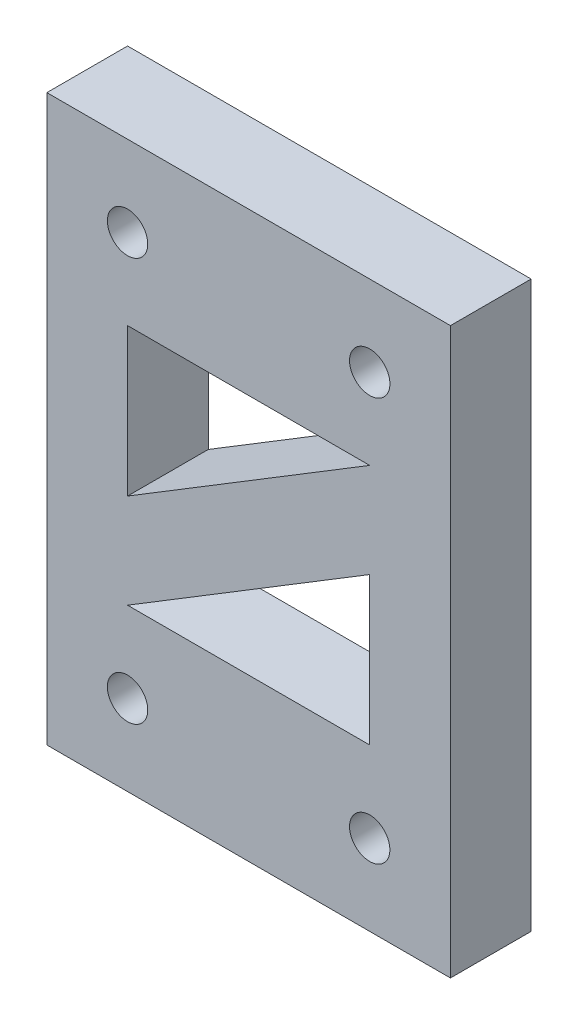
ISO-10303-21;
HEADER;
FILE_DESCRIPTION(('STEP AP214'),'2;1');
FILE_NAME('part.step','',(''),(''),'','','');
FILE_SCHEMA(('AUTOMOTIVE_DESIGN { 1 0 10303 214 1 1 1 1 }'));
ENDSEC;
DATA;
#1=APPLICATION_CONTEXT('core data for automotive mechanical design processes');
#2=APPLICATION_PROTOCOL_DEFINITION('international standard','automotive_design',2000,#1);
#3=PRODUCT_CONTEXT('',#1,'mechanical');
#4=PRODUCT('Part','Part','',(#3));
#5=PRODUCT_RELATED_PRODUCT_CATEGORY('part','',(#4));
#6=PRODUCT_DEFINITION_FORMATION('','',#4);
#7=PRODUCT_DEFINITION_CONTEXT('part definition',#1,'design');
#8=PRODUCT_DEFINITION('design','',#6,#7);
#9=PRODUCT_DEFINITION_SHAPE('','',#8);
#10=(LENGTH_UNIT() NAMED_UNIT(*) SI_UNIT(.MILLI.,.METRE.));
#11=(NAMED_UNIT(*) PLANE_ANGLE_UNIT() SI_UNIT($,.RADIAN.));
#12=(NAMED_UNIT(*) SI_UNIT($,.STERADIAN.) SOLID_ANGLE_UNIT());
#13=UNCERTAINTY_MEASURE_WITH_UNIT(LENGTH_MEASURE(1.E-05),#10,'distance_accuracy_value','');
#14=(GEOMETRIC_REPRESENTATION_CONTEXT(3) GLOBAL_UNCERTAINTY_ASSIGNED_CONTEXT((#13)) GLOBAL_UNIT_ASSIGNED_CONTEXT((#10,
#11,#12)) REPRESENTATION_CONTEXT('',''));
#15=CARTESIAN_POINT('',(0.,0.,0.));
#16=DIRECTION('',(0.,0.,1.));
#17=DIRECTION('',(1.,0.,0.));
#18=AXIS2_PLACEMENT_3D('',#15,#16,#17);
#19=CARTESIAN_POINT('',(0.,0.,-10.));
#20=DIRECTION('',(-1.,0.,0.));
#21=DIRECTION('',(0.,0.,1.));
#22=AXIS2_PLACEMENT_3D('',#19,#20,#21);
#23=PLANE('',#22);
#24=DIRECTION('',(0.,-1.,0.));
#25=VECTOR('',#24,1.);
#26=CARTESIAN_POINT('',(0.,0.,0.));
#27=LINE('',#26,#25);
#28=CARTESIAN_POINT('',(0.,70.,0.));
#29=VERTEX_POINT('',#28);
#30=CARTESIAN_POINT('',(0.,0.,0.));
#31=VERTEX_POINT('',#30);
#32=EDGE_CURVE('E178',#29,#31,#27,.T.);
#33=ORIENTED_EDGE('',*,*,#32,.F.);
#34=DIRECTION('',(0.,0.,1.));
#35=VECTOR('',#34,1.);
#36=CARTESIAN_POINT('',(0.,70.,-10.));
#37=LINE('',#36,#35);
#38=CARTESIAN_POINT('',(0.,70.,-10.));
#39=VERTEX_POINT('',#38);
#40=EDGE_CURVE('E11',#39,#29,#37,.T.);
#41=ORIENTED_EDGE('',*,*,#40,.F.);
#42=DIRECTION('',(0.,-1.,0.));
#43=VECTOR('',#42,1.);
#44=CARTESIAN_POINT('',(0.,0.,-10.));
#45=LINE('',#44,#43);
#46=CARTESIAN_POINT('',(0.,0.,-10.));
#47=VERTEX_POINT('',#46);
#48=EDGE_CURVE('E181',#39,#47,#45,.T.);
#49=ORIENTED_EDGE('',*,*,#48,.T.);
#50=DIRECTION('',(0.,0.,1.));
#51=VECTOR('',#50,1.);
#52=CARTESIAN_POINT('',(0.,0.,-10.));
#53=LINE('',#52,#51);
#54=EDGE_CURVE('E42',#47,#31,#53,.T.);
#55=ORIENTED_EDGE('',*,*,#54,.T.);
#56=EDGE_LOOP('',(#33,#41,#49,#55));
#57=FACE_BOUND('',#56,.T.);
#58=ADVANCED_FACE('F39',(#57),#23,.T.);
#59=CARTESIAN_POINT('',(0.,70.,-10.));
#60=DIRECTION('',(0.,1.,0.));
#61=DIRECTION('',(0.,0.,1.));
#62=AXIS2_PLACEMENT_3D('',#59,#60,#61);
#63=PLANE('',#62);
#64=DIRECTION('',(-1.,0.,0.));
#65=VECTOR('',#64,1.);
#66=CARTESIAN_POINT('',(0.,70.,0.));
#67=LINE('',#66,#65);
#68=CARTESIAN_POINT('',(50.,70.,0.));
#69=VERTEX_POINT('',#68);
#70=EDGE_CURVE('E185',#69,#29,#67,.T.);
#71=ORIENTED_EDGE('',*,*,#70,.F.);
#72=DIRECTION('',(0.,0.,1.));
#73=VECTOR('',#72,1.);
#74=CARTESIAN_POINT('',(50.,70.,-10.));
#75=LINE('',#74,#73);
#76=CARTESIAN_POINT('',(50.,70.,-10.));
#77=VERTEX_POINT('',#76);
#78=EDGE_CURVE('E47',#77,#69,#75,.T.);
#79=ORIENTED_EDGE('',*,*,#78,.F.);
#80=DIRECTION('',(-1.,0.,0.));
#81=VECTOR('',#80,1.);
#82=CARTESIAN_POINT('',(0.,70.,-10.));
#83=LINE('',#82,#81);
#84=EDGE_CURVE('E191',#77,#39,#83,.T.);
#85=ORIENTED_EDGE('',*,*,#84,.T.);
#86=ORIENTED_EDGE('',*,*,#40,.T.);
#87=EDGE_LOOP('',(#71,#79,#85,#86));
#88=FACE_BOUND('',#87,.T.);
#89=ADVANCED_FACE('F217',(#88),#63,.T.);
#90=CARTESIAN_POINT('',(50.,0.,-10.));
#91=DIRECTION('',(1.,0.,0.));
#92=DIRECTION('',(0.,0.,-1.));
#93=AXIS2_PLACEMENT_3D('',#90,#91,#92);
#94=PLANE('',#93);
#95=DIRECTION('',(0.,1.,0.));
#96=VECTOR('',#95,1.);
#97=CARTESIAN_POINT('',(50.,0.,0.));
#98=LINE('',#97,#96);
#99=CARTESIAN_POINT('',(50.,0.,0.));
#100=VERTEX_POINT('',#99);
#101=EDGE_CURVE('E199',#100,#69,#98,.T.);
#102=ORIENTED_EDGE('',*,*,#101,.F.);
#103=DIRECTION('',(0.,0.,1.));
#104=VECTOR('',#103,1.);
#105=CARTESIAN_POINT('',(50.,0.,-10.));
#106=LINE('',#105,#104);
#107=CARTESIAN_POINT('',(50.,0.,-10.));
#108=VERTEX_POINT('',#107);
#109=EDGE_CURVE('E204',#108,#100,#106,.T.);
#110=ORIENTED_EDGE('',*,*,#109,.F.);
#111=DIRECTION('',(0.,1.,0.));
#112=VECTOR('',#111,1.);
#113=CARTESIAN_POINT('',(50.,0.,-10.));
#114=LINE('',#113,#112);
#115=EDGE_CURVE('E188',#108,#77,#114,.T.);
#116=ORIENTED_EDGE('',*,*,#115,.T.);
#117=ORIENTED_EDGE('',*,*,#78,.T.);
#118=EDGE_LOOP('',(#102,#110,#116,#117));
#119=FACE_BOUND('',#118,.T.);
#120=ADVANCED_FACE('F222',(#119),#94,.T.);
#121=CARTESIAN_POINT('',(0.,0.,-10.));
#122=DIRECTION('',(0.,-1.,0.));
#123=DIRECTION('',(0.,0.,-1.));
#124=AXIS2_PLACEMENT_3D('',#121,#122,#123);
#125=PLANE('',#124);
#126=DIRECTION('',(1.,0.,0.));
#127=VECTOR('',#126,1.);
#128=CARTESIAN_POINT('',(0.,0.,0.));
#129=LINE('',#128,#127);
#130=EDGE_CURVE('E196',#31,#100,#129,.T.);
#131=ORIENTED_EDGE('',*,*,#130,.F.);
#132=ORIENTED_EDGE('',*,*,#54,.F.);
#133=DIRECTION('',(1.,0.,0.));
#134=VECTOR('',#133,1.);
#135=CARTESIAN_POINT('',(0.,0.,-10.));
#136=LINE('',#135,#134);
#137=EDGE_CURVE('E184',#47,#108,#136,.T.);
#138=ORIENTED_EDGE('',*,*,#137,.T.);
#139=ORIENTED_EDGE('',*,*,#109,.T.);
#140=EDGE_LOOP('',(#131,#132,#138,#139));
#141=FACE_BOUND('',#140,.T.);
#142=ADVANCED_FACE('F212',(#141),#125,.T.);
#143=CARTESIAN_POINT('',(0.,0.,-10.));
#144=DIRECTION('',(0.,0.,-1.));
#145=DIRECTION('',(-1.,0.,0.));
#146=AXIS2_PLACEMENT_3D('',#143,#144,#145);
#147=PLANE('',#146);
#148=CARTESIAN_POINT('',(40.,9.99999999999999,-10.));
#149=DIRECTION('',(0.,0.,-1.));
#150=DIRECTION('',(-1.,0.,0.));
#151=AXIS2_PLACEMENT_3D('',#148,#149,#150);
#152=CIRCLE('',#151,2.5);
#153=CARTESIAN_POINT('',(37.5,9.99999999999999,-10.));
#154=VERTEX_POINT('',#153);
#155=EDGE_CURVE('E402',#154,#154,#152,.F.);
#156=ORIENTED_EDGE('',*,*,#155,.T.);
#157=EDGE_LOOP('',(#156));
#158=FACE_BOUND('',#157,.T.);
#159=CARTESIAN_POINT('',(10.,60.,-10.));
#160=DIRECTION('',(0.,0.,-1.));
#161=DIRECTION('',(-1.,0.,0.));
#162=AXIS2_PLACEMENT_3D('',#159,#160,#161);
#163=CIRCLE('',#162,2.5);
#164=CARTESIAN_POINT('',(7.50000000000001,60.,-10.));
#165=VERTEX_POINT('',#164);
#166=EDGE_CURVE('E406',#165,#165,#163,.F.);
#167=ORIENTED_EDGE('',*,*,#166,.T.);
#168=EDGE_LOOP('',(#167));
#169=FACE_BOUND('',#168,.T.);
#170=DIRECTION('',(0.,-1.,0.));
#171=VECTOR('',#170,1.);
#172=CARTESIAN_POINT('',(10.,31.7116460960662,-10.));
#173=LINE('',#172,#171);
#174=CARTESIAN_POINT('',(10.,50.,-10.));
#175=VERTEX_POINT('',#174);
#176=CARTESIAN_POINT('',(10.,31.7116460960662,-10.));
#177=VERTEX_POINT('',#176);
#178=EDGE_CURVE('E126',#175,#177,#173,.T.);
#179=ORIENTED_EDGE('',*,*,#178,.T.);
#180=DIRECTION('',(0.853850937602943,0.52051760426961,0.));
#181=VECTOR('',#180,1.);
#182=CARTESIAN_POINT('',(40.,50.,-10.));
#183=LINE('',#182,#181);
#184=CARTESIAN_POINT('',(40.,50.,-10.));
#185=VERTEX_POINT('',#184);
#186=EDGE_CURVE('E115',#177,#185,#183,.T.);
#187=ORIENTED_EDGE('',*,*,#186,.T.);
#188=DIRECTION('',(-1.,0.,0.));
#189=VECTOR('',#188,1.);
#190=CARTESIAN_POINT('',(10.,50.,-10.));
#191=LINE('',#190,#189);
#192=EDGE_CURVE('E132',#185,#175,#191,.T.);
#193=ORIENTED_EDGE('',*,*,#192,.T.);
#194=EDGE_LOOP('',(#179,#187,#193));
#195=FACE_BOUND('',#194,.T.);
#196=DIRECTION('',(-0.853850937602944,-0.52051760426961,0.));
#197=VECTOR('',#196,1.);
#198=CARTESIAN_POINT('',(10.,20.,-10.));
#199=LINE('',#198,#197);
#200=CARTESIAN_POINT('',(40.,38.2883539039338,-10.));
#201=VERTEX_POINT('',#200);
#202=CARTESIAN_POINT('',(10.,20.,-10.));
#203=VERTEX_POINT('',#202);
#204=EDGE_CURVE('E147',#201,#203,#199,.T.);
#205=ORIENTED_EDGE('',*,*,#204,.T.);
#206=DIRECTION('',(1.,0.,0.));
#207=VECTOR('',#206,1.);
#208=CARTESIAN_POINT('',(40.,20.,-10.));
#209=LINE('',#208,#207);
#210=CARTESIAN_POINT('',(40.,20.,-10.));
#211=VERTEX_POINT('',#210);
#212=EDGE_CURVE('E161',#203,#211,#209,.T.);
#213=ORIENTED_EDGE('',*,*,#212,.T.);
#214=DIRECTION('',(0.,1.,0.));
#215=VECTOR('',#214,1.);
#216=CARTESIAN_POINT('',(40.,38.2883539039338,-10.));
#217=LINE('',#216,#215);
#218=EDGE_CURVE('E122',#211,#201,#217,.T.);
#219=ORIENTED_EDGE('',*,*,#218,.T.);
#220=EDGE_LOOP('',(#205,#213,#219));
#221=FACE_BOUND('',#220,.T.);
#222=CARTESIAN_POINT('',(10.,10.,-10.));
#223=DIRECTION('',(0.,0.,-1.));
#224=DIRECTION('',(-1.,0.,0.));
#225=AXIS2_PLACEMENT_3D('',#222,#223,#224);
#226=CIRCLE('',#225,2.5);
#227=CARTESIAN_POINT('',(7.5,10.,-10.));
#228=VERTEX_POINT('',#227);
#229=EDGE_CURVE('E168',#228,#228,#226,.F.);
#230=ORIENTED_EDGE('',*,*,#229,.T.);
#231=EDGE_LOOP('',(#230));
#232=FACE_BOUND('',#231,.T.);
#233=CARTESIAN_POINT('',(40.,60.,-10.));
#234=DIRECTION('',(0.,0.,-1.));
#235=DIRECTION('',(-1.,0.,0.));
#236=AXIS2_PLACEMENT_3D('',#233,#234,#235);
#237=CIRCLE('',#236,2.5);
#238=CARTESIAN_POINT('',(37.5,60.,-10.));
#239=VERTEX_POINT('',#238);
#240=EDGE_CURVE('E172',#239,#239,#237,.F.);
#241=ORIENTED_EDGE('',*,*,#240,.T.);
#242=EDGE_LOOP('',(#241));
#243=FACE_BOUND('',#242,.T.);
#244=ORIENTED_EDGE('',*,*,#48,.F.);
#245=ORIENTED_EDGE('',*,*,#84,.F.);
#246=ORIENTED_EDGE('',*,*,#115,.F.);
#247=ORIENTED_EDGE('',*,*,#137,.F.);
#248=EDGE_LOOP('',(#244,#245,#246,#247));
#249=FACE_BOUND('',#248,.T.);
#250=ADVANCED_FACE('F130',(#158,#169,#195,#221,#232,#243,#249),#147,.T.);
#251=CARTESIAN_POINT('',(0.,0.,0.));
#252=DIRECTION('',(0.,0.,-1.));
#253=DIRECTION('',(-1.,0.,0.));
#254=AXIS2_PLACEMENT_3D('',#251,#252,#253);
#255=PLANE('',#254);
#256=CARTESIAN_POINT('',(40.,9.99999999999999,0.));
#257=DIRECTION('',(0.,0.,1.));
#258=DIRECTION('',(-1.,0.,0.));
#259=AXIS2_PLACEMENT_3D('',#256,#257,#258);
#260=CIRCLE('',#259,2.5);
#261=CARTESIAN_POINT('',(37.5,9.99999999999999,0.));
#262=VERTEX_POINT('',#261);
#263=EDGE_CURVE('E405',#262,#262,#260,.T.);
#264=ORIENTED_EDGE('',*,*,#263,.F.);
#265=EDGE_LOOP('',(#264));
#266=FACE_BOUND('',#265,.T.);
#267=CARTESIAN_POINT('',(10.,60.,0.));
#268=DIRECTION('',(0.,0.,1.));
#269=DIRECTION('',(-1.,0.,0.));
#270=AXIS2_PLACEMENT_3D('',#267,#268,#269);
#271=CIRCLE('',#270,2.5);
#272=CARTESIAN_POINT('',(7.50000000000001,60.,0.));
#273=VERTEX_POINT('',#272);
#274=EDGE_CURVE('E136',#273,#273,#271,.T.);
#275=ORIENTED_EDGE('',*,*,#274,.F.);
#276=EDGE_LOOP('',(#275));
#277=FACE_BOUND('',#276,.T.);
#278=DIRECTION('',(0.853850937602943,0.52051760426961,0.));
#279=VECTOR('',#278,1.);
#280=CARTESIAN_POINT('',(40.,50.,0.));
#281=LINE('',#280,#279);
#282=CARTESIAN_POINT('',(10.,31.7116460960662,0.));
#283=VERTEX_POINT('',#282);
#284=CARTESIAN_POINT('',(40.,50.,0.));
#285=VERTEX_POINT('',#284);
#286=EDGE_CURVE('E134',#283,#285,#281,.T.);
#287=ORIENTED_EDGE('',*,*,#286,.F.);
#288=DIRECTION('',(0.,-1.,0.));
#289=VECTOR('',#288,1.);
#290=CARTESIAN_POINT('',(10.,31.7116460960662,0.));
#291=LINE('',#290,#289);
#292=CARTESIAN_POINT('',(10.,50.,0.));
#293=VERTEX_POINT('',#292);
#294=EDGE_CURVE('E63',#293,#283,#291,.T.);
#295=ORIENTED_EDGE('',*,*,#294,.F.);
#296=DIRECTION('',(-1.,0.,0.));
#297=VECTOR('',#296,1.);
#298=CARTESIAN_POINT('',(10.,50.,0.));
#299=LINE('',#298,#297);
#300=EDGE_CURVE('E128',#285,#293,#299,.T.);
#301=ORIENTED_EDGE('',*,*,#300,.F.);
#302=EDGE_LOOP('',(#287,#295,#301));
#303=FACE_BOUND('',#302,.T.);
#304=DIRECTION('',(1.,0.,0.));
#305=VECTOR('',#304,1.);
#306=CARTESIAN_POINT('',(40.,20.,0.));
#307=LINE('',#306,#305);
#308=CARTESIAN_POINT('',(10.,20.,0.));
#309=VERTEX_POINT('',#308);
#310=CARTESIAN_POINT('',(40.,20.,0.));
#311=VERTEX_POINT('',#310);
#312=EDGE_CURVE('E152',#309,#311,#307,.T.);
#313=ORIENTED_EDGE('',*,*,#312,.F.);
#314=DIRECTION('',(-0.853850937602944,-0.52051760426961,0.));
#315=VECTOR('',#314,1.);
#316=CARTESIAN_POINT('',(10.,20.,0.));
#317=LINE('',#316,#315);
#318=CARTESIAN_POINT('',(40.,38.2883539039338,0.));
#319=VERTEX_POINT('',#318);
#320=EDGE_CURVE('E150',#319,#309,#317,.T.);
#321=ORIENTED_EDGE('',*,*,#320,.F.);
#322=DIRECTION('',(0.,1.,0.));
#323=VECTOR('',#322,1.);
#324=CARTESIAN_POINT('',(40.,38.2883539039338,0.));
#325=LINE('',#324,#323);
#326=EDGE_CURVE('E155',#311,#319,#325,.T.);
#327=ORIENTED_EDGE('',*,*,#326,.F.);
#328=EDGE_LOOP('',(#313,#321,#327));
#329=FACE_BOUND('',#328,.T.);
#330=CARTESIAN_POINT('',(10.,10.,0.));
#331=DIRECTION('',(0.,0.,1.));
#332=DIRECTION('',(1.,0.,0.));
#333=AXIS2_PLACEMENT_3D('',#330,#331,#332);
#334=CIRCLE('',#333,2.5);
#335=CARTESIAN_POINT('',(12.5,10.,0.));
#336=VERTEX_POINT('',#335);
#337=EDGE_CURVE('E169',#336,#336,#334,.T.);
#338=ORIENTED_EDGE('',*,*,#337,.F.);
#339=EDGE_LOOP('',(#338));
#340=FACE_BOUND('',#339,.T.);
#341=CARTESIAN_POINT('',(40.,60.,0.));
#342=DIRECTION('',(0.,0.,1.));
#343=DIRECTION('',(1.,0.,0.));
#344=AXIS2_PLACEMENT_3D('',#341,#342,#343);
#345=CIRCLE('',#344,2.5);
#346=CARTESIAN_POINT('',(42.5,60.,0.));
#347=VERTEX_POINT('',#346);
#348=EDGE_CURVE('E175',#347,#347,#345,.T.);
#349=ORIENTED_EDGE('',*,*,#348,.F.);
#350=EDGE_LOOP('',(#349));
#351=FACE_BOUND('',#350,.T.);
#352=ORIENTED_EDGE('',*,*,#32,.T.);
#353=ORIENTED_EDGE('',*,*,#130,.T.);
#354=ORIENTED_EDGE('',*,*,#101,.T.);
#355=ORIENTED_EDGE('',*,*,#70,.T.);
#356=EDGE_LOOP('',(#352,#353,#354,#355));
#357=FACE_BOUND('',#356,.T.);
#358=ADVANCED_FACE('F214',(#266,#277,#303,#329,#340,#351,#357),#255,.F.);
#359=CARTESIAN_POINT('',(40.,60.,-10.001));
#360=DIRECTION('',(0.,0.,1.));
#361=DIRECTION('',(1.,0.,0.));
#362=AXIS2_PLACEMENT_3D('',#359,#360,#361);
#363=CYLINDRICAL_SURFACE('',#362,2.5);
#364=ORIENTED_EDGE('',*,*,#240,.F.);
#365=EDGE_LOOP('',(#364));
#366=FACE_BOUND('',#365,.T.);
#367=ORIENTED_EDGE('',*,*,#348,.T.);
#368=EDGE_LOOP('',(#367));
#369=FACE_BOUND('',#368,.T.);
#370=ADVANCED_FACE('F269',(#366,#369),#363,.F.);
#371=CARTESIAN_POINT('',(10.,10.,-10.001));
#372=DIRECTION('',(0.,0.,1.));
#373=DIRECTION('',(1.,0.,0.));
#374=AXIS2_PLACEMENT_3D('',#371,#372,#373);
#375=CYLINDRICAL_SURFACE('',#374,2.5);
#376=ORIENTED_EDGE('',*,*,#229,.F.);
#377=EDGE_LOOP('',(#376));
#378=FACE_BOUND('',#377,.T.);
#379=ORIENTED_EDGE('',*,*,#337,.T.);
#380=EDGE_LOOP('',(#379));
#381=FACE_BOUND('',#380,.T.);
#382=ADVANCED_FACE('F280',(#378,#381),#375,.F.);
#383=CARTESIAN_POINT('',(10.,20.,-10.001));
#384=DIRECTION('',(-0.52051760426961,0.853850937602944,0.));
#385=DIRECTION('',(-0.853850937602944,-0.52051760426961,0.));
#386=AXIS2_PLACEMENT_3D('',#383,#384,#385);
#387=PLANE('',#386);
#388=DIRECTION('',(0.,0.,1.));
#389=VECTOR('',#388,1.);
#390=CARTESIAN_POINT('',(40.,38.2883539039338,-10.001));
#391=LINE('',#390,#389);
#392=EDGE_CURVE('E159',#201,#319,#391,.T.);
#393=ORIENTED_EDGE('',*,*,#392,.T.);
#394=ORIENTED_EDGE('',*,*,#320,.T.);
#395=DIRECTION('',(0.,0.,1.));
#396=VECTOR('',#395,1.);
#397=CARTESIAN_POINT('',(10.,20.,-10.001));
#398=LINE('',#397,#396);
#399=EDGE_CURVE('E158',#203,#309,#398,.T.);
#400=ORIENTED_EDGE('',*,*,#399,.F.);
#401=ORIENTED_EDGE('',*,*,#204,.F.);
#402=EDGE_LOOP('',(#393,#394,#400,#401));
#403=FACE_BOUND('',#402,.T.);
#404=ADVANCED_FACE('F291',(#403),#387,.F.);
#405=CARTESIAN_POINT('',(40.,38.2883539039338,-10.001));
#406=DIRECTION('',(1.,0.,0.));
#407=DIRECTION('',(0.,0.,-1.));
#408=AXIS2_PLACEMENT_3D('',#405,#406,#407);
#409=PLANE('',#408);
#410=DIRECTION('',(0.,0.,1.));
#411=VECTOR('',#410,1.);
#412=CARTESIAN_POINT('',(40.,20.,-10.001));
#413=LINE('',#412,#411);
#414=EDGE_CURVE('E162',#211,#311,#413,.T.);
#415=ORIENTED_EDGE('',*,*,#414,.T.);
#416=ORIENTED_EDGE('',*,*,#326,.T.);
#417=ORIENTED_EDGE('',*,*,#392,.F.);
#418=ORIENTED_EDGE('',*,*,#218,.F.);
#419=EDGE_LOOP('',(#415,#416,#417,#418));
#420=FACE_BOUND('',#419,.T.);
#421=ADVANCED_FACE('F302',(#420),#409,.F.);
#422=CARTESIAN_POINT('',(40.,20.,-10.001));
#423=DIRECTION('',(0.,-1.,0.));
#424=DIRECTION('',(1.,0.,0.));
#425=AXIS2_PLACEMENT_3D('',#422,#423,#424);
#426=PLANE('',#425);
#427=ORIENTED_EDGE('',*,*,#399,.T.);
#428=ORIENTED_EDGE('',*,*,#312,.T.);
#429=ORIENTED_EDGE('',*,*,#414,.F.);
#430=ORIENTED_EDGE('',*,*,#212,.F.);
#431=EDGE_LOOP('',(#427,#428,#429,#430));
#432=FACE_BOUND('',#431,.T.);
#433=ADVANCED_FACE('F313',(#432),#426,.F.);
#434=CARTESIAN_POINT('',(10.,31.7116460960662,-10.001));
#435=DIRECTION('',(-1.,0.,0.));
#436=DIRECTION('',(0.,0.,1.));
#437=AXIS2_PLACEMENT_3D('',#434,#435,#436);
#438=PLANE('',#437);
#439=DIRECTION('',(0.,0.,1.));
#440=VECTOR('',#439,1.);
#441=CARTESIAN_POINT('',(10.,50.,-10.001));
#442=LINE('',#441,#440);
#443=EDGE_CURVE('E123',#175,#293,#442,.T.);
#444=ORIENTED_EDGE('',*,*,#443,.T.);
#445=ORIENTED_EDGE('',*,*,#294,.T.);
#446=DIRECTION('',(0.,0.,1.));
#447=VECTOR('',#446,1.);
#448=CARTESIAN_POINT('',(10.,31.7116460960662,-10.001));
#449=LINE('',#448,#447);
#450=EDGE_CURVE('E117',#177,#283,#449,.T.);
#451=ORIENTED_EDGE('',*,*,#450,.F.);
#452=ORIENTED_EDGE('',*,*,#178,.F.);
#453=EDGE_LOOP('',(#444,#445,#451,#452));
#454=FACE_BOUND('',#453,.T.);
#455=ADVANCED_FACE('F125',(#454),#438,.F.);
#456=CARTESIAN_POINT('',(10.,50.,-10.001));
#457=DIRECTION('',(0.,1.,0.));
#458=DIRECTION('',(-1.,0.,0.));
#459=AXIS2_PLACEMENT_3D('',#456,#457,#458);
#460=PLANE('',#459);
#461=DIRECTION('',(0.,0.,1.));
#462=VECTOR('',#461,1.);
#463=CARTESIAN_POINT('',(40.,50.,-10.001));
#464=LINE('',#463,#462);
#465=EDGE_CURVE('E55',#185,#285,#464,.T.);
#466=ORIENTED_EDGE('',*,*,#465,.T.);
#467=ORIENTED_EDGE('',*,*,#300,.T.);
#468=ORIENTED_EDGE('',*,*,#443,.F.);
#469=ORIENTED_EDGE('',*,*,#192,.F.);
#470=EDGE_LOOP('',(#466,#467,#468,#469));
#471=FACE_BOUND('',#470,.T.);
#472=ADVANCED_FACE('F334',(#471),#460,.F.);
#473=CARTESIAN_POINT('',(40.,50.,-10.001));
#474=DIRECTION('',(0.52051760426961,-0.853850937602943,0.));
#475=DIRECTION('',(0.853850937602943,0.52051760426961,0.));
#476=AXIS2_PLACEMENT_3D('',#473,#474,#475);
#477=PLANE('',#476);
#478=ORIENTED_EDGE('',*,*,#450,.T.);
#479=ORIENTED_EDGE('',*,*,#286,.T.);
#480=ORIENTED_EDGE('',*,*,#465,.F.);
#481=ORIENTED_EDGE('',*,*,#186,.F.);
#482=EDGE_LOOP('',(#478,#479,#480,#481));
#483=FACE_BOUND('',#482,.T.);
#484=ADVANCED_FACE('F116',(#483),#477,.F.);
#485=CARTESIAN_POINT('',(10.,60.,-10.001));
#486=DIRECTION('',(0.,0.,1.));
#487=DIRECTION('',(1.,0.,0.));
#488=AXIS2_PLACEMENT_3D('',#485,#486,#487);
#489=CYLINDRICAL_SURFACE('',#488,2.5);
#490=ORIENTED_EDGE('',*,*,#166,.F.);
#491=EDGE_LOOP('',(#490));
#492=FACE_BOUND('',#491,.T.);
#493=ORIENTED_EDGE('',*,*,#274,.T.);
#494=EDGE_LOOP('',(#493));
#495=FACE_BOUND('',#494,.T.);
#496=ADVANCED_FACE('F354',(#492,#495),#489,.F.);
#497=CARTESIAN_POINT('',(40.,9.99999999999999,-10.001));
#498=DIRECTION('',(0.,0.,1.));
#499=DIRECTION('',(1.,0.,0.));
#500=AXIS2_PLACEMENT_3D('',#497,#498,#499);
#501=CYLINDRICAL_SURFACE('',#500,2.5);
#502=ORIENTED_EDGE('',*,*,#155,.F.);
#503=EDGE_LOOP('',(#502));
#504=FACE_BOUND('',#503,.T.);
#505=ORIENTED_EDGE('',*,*,#263,.T.);
#506=EDGE_LOOP('',(#505));
#507=FACE_BOUND('',#506,.T.);
#508=ADVANCED_FACE('F364',(#504,#507),#501,.F.);
#509=CLOSED_SHELL('',(#58,#89,#120,#142,#250,#358,#370,#382,#404,#421,#433,#455,#472,#484,#496,#508));
#510=MANIFOLD_SOLID_BREP('B2',#509);
#511=ADVANCED_BREP_SHAPE_REPRESENTATION('',(#18,#510),#14);
#512=SHAPE_DEFINITION_REPRESENTATION(#9,#511);
ENDSEC;
END-ISO-10303-21;
